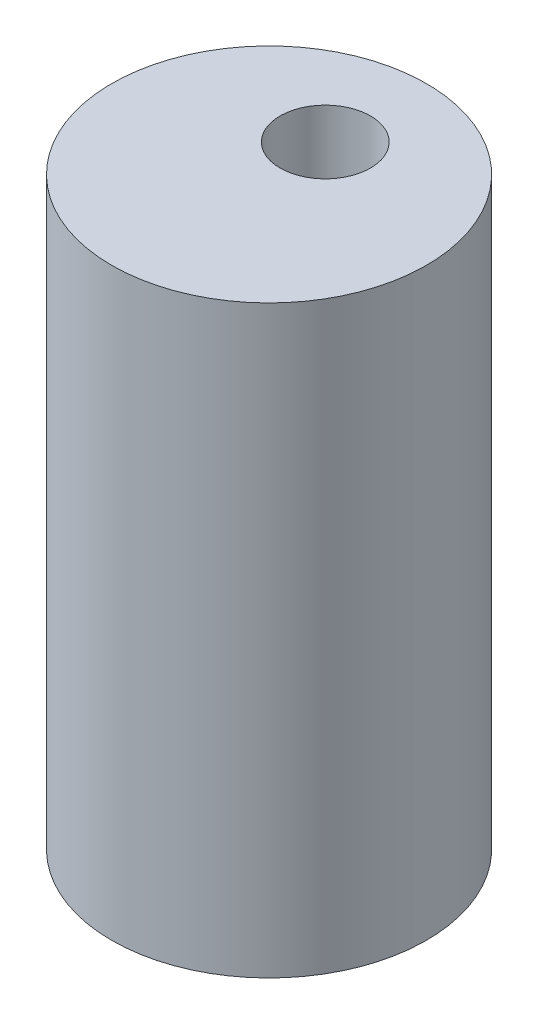
ISO-10303-21;
HEADER;
FILE_DESCRIPTION(('STEP AP214'),'2;1');
FILE_NAME('part.step','',(''),(''),'','','');
FILE_SCHEMA(('AUTOMOTIVE_DESIGN { 1 0 10303 214 1 1 1 1 }'));
ENDSEC;
DATA;
#1=APPLICATION_CONTEXT('core data for automotive mechanical design processes');
#2=APPLICATION_PROTOCOL_DEFINITION('international standard','automotive_design',2000,#1);
#3=PRODUCT_CONTEXT('',#1,'mechanical');
#4=PRODUCT('Part','Part','',(#3));
#5=PRODUCT_RELATED_PRODUCT_CATEGORY('part','',(#4));
#6=PRODUCT_DEFINITION_FORMATION('','',#4);
#7=PRODUCT_DEFINITION_CONTEXT('part definition',#1,'design');
#8=PRODUCT_DEFINITION('design','',#6,#7);
#9=PRODUCT_DEFINITION_SHAPE('','',#8);
#10=(LENGTH_UNIT() NAMED_UNIT(*) SI_UNIT(.MILLI.,.METRE.));
#11=(NAMED_UNIT(*) PLANE_ANGLE_UNIT() SI_UNIT($,.RADIAN.));
#12=(NAMED_UNIT(*) SI_UNIT($,.STERADIAN.) SOLID_ANGLE_UNIT());
#13=UNCERTAINTY_MEASURE_WITH_UNIT(LENGTH_MEASURE(1.E-05),#10,'distance_accuracy_value','');
#14=(GEOMETRIC_REPRESENTATION_CONTEXT(3) GLOBAL_UNCERTAINTY_ASSIGNED_CONTEXT((#13)) GLOBAL_UNIT_ASSIGNED_CONTEXT((#10,
#11,#12)) REPRESENTATION_CONTEXT('',''));
#15=CARTESIAN_POINT('',(0.,0.,0.));
#16=DIRECTION('',(0.,0.,1.));
#17=DIRECTION('',(1.,0.,0.));
#18=AXIS2_PLACEMENT_3D('',#15,#16,#17);
#19=CARTESIAN_POINT('',(0.,33.02,0.));
#20=DIRECTION('',(0.,-1.,0.));
#21=DIRECTION('',(0.,0.,-1.));
#22=AXIS2_PLACEMENT_3D('',#19,#20,#21);
#23=CYLINDRICAL_SURFACE('',#22,8.89);
#24=CARTESIAN_POINT('',(0.,11.65,-8.89));
#25=CARTESIAN_POINT('',(-0.0918360669877457,11.64999647283,-8.88999834303565));
#26=CARTESIAN_POINT('',(-0.183718222082188,11.6423069435029,-8.8885622582549));
#27=CARTESIAN_POINT('',(-0.364894510607066,11.6117711269655,-8.88297183715094));
#28=CARTESIAN_POINT('',(-0.454186373493418,11.5889119381136,-8.87881518705586));
#29=CARTESIAN_POINT('',(-0.627535571597222,11.5287598925168,-8.86824872883214));
#30=CARTESIAN_POINT('',(-0.711597513886059,11.4914799542296,-8.86184093780053));
#31=CARTESIAN_POINT('',(-0.872265407970495,11.4035810545302,-8.84747238156531));
#32=CARTESIAN_POINT('',(-0.948871986170377,11.3529632151039,-8.83951174700171));
#33=CARTESIAN_POINT('',(-1.0933623552347,11.2391941507481,-8.82281198574771));
#34=CARTESIAN_POINT('',(-1.16114591313639,11.1759166863103,-8.81406555084944));
#35=CARTESIAN_POINT('',(-1.28519912345379,11.0388961640361,-8.79683436847875));
#36=CARTESIAN_POINT('',(-1.3414679588416,10.9651523641884,-8.78834963961194));
#37=CARTESIAN_POINT('',(-1.44130991049973,10.8085860103999,-8.77253153492492));
#38=CARTESIAN_POINT('',(-1.48478133569139,10.7256975723758,-8.76520758410381));
#39=CARTESIAN_POINT('',(-1.55714355432885,10.5536354428308,-8.75264311096605));
#40=CARTESIAN_POINT('',(-1.58603557870358,10.4644622826496,-8.74740241276973));
#41=CARTESIAN_POINT('',(-1.62809772962431,10.2834335676463,-8.73967129984026));
#42=CARTESIAN_POINT('',(-1.64144249503182,10.1916199196691,-8.73715035895968));
#43=CARTESIAN_POINT('',(-1.65257333145617,10.0070248263135,-8.73505212846404));
#44=CARTESIAN_POINT('',(-1.65036076928692,9.91424346667,-8.73547458025248));
#45=CARTESIAN_POINT('',(-1.63058142770806,9.73161012096328,-8.73918760321734));
#46=CARTESIAN_POINT('',(-1.6132130014774,9.64173578866355,-8.74244112112337));
#47=CARTESIAN_POINT('',(-1.56392722949666,9.46619921773037,-8.7513915054644));
#48=CARTESIAN_POINT('',(-1.53200927681838,9.38053715497537,-8.75708847382646));
#49=CARTESIAN_POINT('',(-1.45433582547568,9.21527509931693,-8.77032271235711));
#50=CARTESIAN_POINT('',(-1.40850001750583,9.13571373834792,-8.77787061286426));
#51=CARTESIAN_POINT('',(-1.30434878394506,8.98533671980322,-8.79394919567166));
#52=CARTESIAN_POINT('',(-1.24603211650342,8.91452193362199,-8.80247997572982));
#53=CARTESIAN_POINT('',(-1.11750404515385,8.78250199761913,-8.81972469620462));
#54=CARTESIAN_POINT('',(-1.04712293208009,8.72146205183848,-8.82843943127757));
#55=CARTESIAN_POINT('',(-0.897032291024137,8.61203078175849,-8.84494905172169));
#56=CARTESIAN_POINT('',(-0.817322673063593,8.56363957947751,-8.85274392821888));
#57=CARTESIAN_POINT('',(-0.650666986376907,8.48085600174954,-8.86655081929005));
#58=CARTESIAN_POINT('',(-0.56371231582386,8.44648056043338,-8.8725606747996));
#59=CARTESIAN_POINT('',(-0.385126539176933,8.39287000825036,-8.88210363716019));
#60=CARTESIAN_POINT('',(-0.293495920751786,8.37363332193942,-8.88563700172789));
#61=CARTESIAN_POINT('',(-0.109580861960284,8.35107571155816,-8.88979353931392));
#62=CARTESIAN_POINT('',(-0.0173250945351158,8.34752839139869,-8.89045810543594));
#63=CARTESIAN_POINT('',(0.166461448475768,8.35584327832163,-8.88891641528337));
#64=CARTESIAN_POINT('',(0.257992258721995,8.36770474417421,-8.88671029710123));
#65=CARTESIAN_POINT('',(0.437014365909573,8.40631226420596,-8.87970088152735));
#66=CARTESIAN_POINT('',(0.524531166189811,8.43294399861579,-8.87491753949292));
#67=CARTESIAN_POINT('',(0.693857609465163,8.50021254408845,-8.86328780360091));
#68=CARTESIAN_POINT('',(0.775666870646203,8.54085029102559,-8.85644127188593));
#69=CARTESIAN_POINT('',(0.932223824168602,8.63548005198676,-8.84134136442335));
#70=CARTESIAN_POINT('',(1.00688631320318,8.68961069799965,-8.83307367953765));
#71=CARTESIAN_POINT('',(1.14614914716783,8.80950179820262,-8.81608602597825));
#72=CARTESIAN_POINT('',(1.21074857174194,8.87526331496524,-8.80736601603255));
#73=CARTESIAN_POINT('',(1.32890979773657,9.01757348294662,-8.79031951917097));
#74=CARTESIAN_POINT('',(1.3823172399646,9.0942512195168,-8.78199961943365));
#75=CARTESIAN_POINT('',(1.47549388738453,9.25562285786981,-8.76682699569519));
#76=CARTESIAN_POINT('',(1.51526359305373,9.34031646534084,-8.75997421785711));
#77=CARTESIAN_POINT('',(1.57981584904159,9.51492004044567,-8.74856321964528));
#78=CARTESIAN_POINT('',(1.60466972751142,9.6048028918009,-8.74399409657341));
#79=CARTESIAN_POINT('',(1.63890525586816,9.78756125700617,-8.73764259313261));
#80=CARTESIAN_POINT('',(1.64828861222198,9.88043643963648,-8.73585990540867));
#81=CARTESIAN_POINT('',(1.65126053733843,10.0649973892954,-8.73529848352062));
#82=CARTESIAN_POINT('',(1.64509253818836,10.1566791841931,-8.73647345142823));
#83=CARTESIAN_POINT('',(1.61766916571017,10.3376750041969,-8.74159240503477));
#84=CARTESIAN_POINT('',(1.59641387823341,10.4269890427733,-8.74553637497721));
#85=CARTESIAN_POINT('',(1.53952111511761,10.6005866185351,-8.75572962910272));
#86=CARTESIAN_POINT('',(1.50390948588735,10.6848788852853,-8.76197476865189));
#87=CARTESIAN_POINT('',(1.41934137828825,10.8463312196047,-8.77606971738909));
#88=CARTESIAN_POINT('',(1.37038398344548,10.9234907968738,-8.7839196367705));
#89=CARTESIAN_POINT('',(1.25966559219495,11.069707891699,-8.80048366955364));
#90=CARTESIAN_POINT('',(1.19772724245607,11.1386298913792,-8.80920877468623));
#91=CARTESIAN_POINT('',(1.0631754137633,11.2651835746176,-8.82645733620379));
#92=CARTESIAN_POINT('',(0.990559485307116,11.3228126604167,-8.83498074579631));
#93=CARTESIAN_POINT('',(0.835949120441948,11.4256172552533,-8.85095340184502));
#94=CARTESIAN_POINT('',(0.753877816618033,11.4706787766476,-8.85839254166897));
#95=CARTESIAN_POINT('',(0.583218459592901,11.5463020937754,-8.87125984086522));
#96=CARTESIAN_POINT('',(0.494636654963317,11.5768775881314,-8.87668989904423));
#97=CARTESIAN_POINT('',(0.3381550553749,11.6164114603862,-8.88381264039154));
#98=CARTESIAN_POINT('',(0.271173332415485,11.6289857679477,-8.88611986461802));
#99=CARTESIAN_POINT('',(0.136136164896605,11.6457812426063,-8.88921413993815));
#100=CARTESIAN_POINT('',(0.0680807467410451,11.6500026147937,-8.89000122835585));
#101=CARTESIAN_POINT('',(0.,11.65,-8.89));
#102=B_SPLINE_CURVE_WITH_KNOTS('',3,(#24,#25,#26,#27,#28,#29,#30,#31,#32,#33,#34,#35,#36,#37,
#38,#39,#40,#41,#42,#43,#44,#45,#46,#47,#48,#49,#50,#51,#52,#53,#54,#55,#56,#57,#58,#59,#60,#61,
#62,#63,#64,#65,#66,#67,#68,#69,#70,#71,#72,#73,#74,#75,#76,#77,#78,#79,#80,#81,#82,#83,#84,#85,
#86,#87,#88,#89,#90,#91,#92,#93,#94,#95,#96,#97,#98,#99,#100,#101),.UNSPECIFIED.,.T.,.F.,(4,2,2,
2,2,2,2,2,2,2,2,2,2,2,2,2,2,2,2,2,2,2,2,2,2,2,2,2,2,2,2,2,2,2,2,2,2,2,4),(0.,0.275259237063431,
0.550752879860564,0.826000298170887,1.10122457002126,1.37934396577062,1.65748308866312,
1.93777614170873,2.21804552584067,2.49513539156108,2.77220091341212,3.0456938076683,
3.31919811162536,3.59431159769617,3.86945247041094,4.14884033945583,4.42823090356605,
4.7079580398671,4.98765606196682,5.26330461732182,5.53893991326959,5.81247101741687,
6.08602040231177,6.36250539824232,6.6390156663354,6.91911954137987,7.1992131360795,
7.47795641098328,7.75666893721517,8.03104582861506,8.30542115873757,8.57930470823611,
8.85320707047261,9.13112903972105,9.40911486573917,9.68954559173565,9.96971059820533,
10.1737732846845,10.3778309607297),.UNSPECIFIED.);
#103=CARTESIAN_POINT('',(0.,11.65,-8.89));
#104=VERTEX_POINT('',#103);
#105=EDGE_CURVE('E79',#104,#104,#102,.T.);
#106=ORIENTED_EDGE('',*,*,#105,.T.);
#107=EDGE_LOOP('',(#106));
#108=FACE_BOUND('',#107,.T.);
#109=CARTESIAN_POINT('',(0.,33.02,0.));
#110=DIRECTION('',(0.,1.,0.));
#111=DIRECTION('',(0.,0.,1.));
#112=AXIS2_PLACEMENT_3D('',#109,#110,#111);
#113=CIRCLE('',#112,8.89);
#114=CARTESIAN_POINT('',(0.,33.02,8.89));
#115=VERTEX_POINT('',#114);
#116=EDGE_CURVE('E11',#115,#115,#113,.T.);
#117=ORIENTED_EDGE('',*,*,#116,.F.);
#118=EDGE_LOOP('',(#117));
#119=FACE_BOUND('',#118,.T.);
#120=CARTESIAN_POINT('',(0.,0.,0.));
#121=DIRECTION('',(0.,1.,0.));
#122=DIRECTION('',(0.,0.,1.));
#123=AXIS2_PLACEMENT_3D('',#120,#121,#122);
#124=CIRCLE('',#123,8.89);
#125=CARTESIAN_POINT('',(0.,0.,8.89));
#126=VERTEX_POINT('',#125);
#127=EDGE_CURVE('E48',#126,#126,#124,.T.);
#128=ORIENTED_EDGE('',*,*,#127,.T.);
#129=EDGE_LOOP('',(#128));
#130=FACE_BOUND('',#129,.T.);
#131=ADVANCED_FACE('F44',(#108,#119,#130),#23,.T.);
#132=CARTESIAN_POINT('',(0.,33.02,0.));
#133=DIRECTION('',(0.,1.,0.));
#134=DIRECTION('',(0.,0.,1.));
#135=AXIS2_PLACEMENT_3D('',#132,#133,#134);
#136=PLANE('',#135);
#137=CARTESIAN_POINT('',(0.,33.02,-3.175));
#138=DIRECTION('',(0.,1.,0.));
#139=DIRECTION('',(0.,0.,1.));
#140=AXIS2_PLACEMENT_3D('',#137,#138,#139);
#141=CIRCLE('',#140,2.55269999999999);
#142=CARTESIAN_POINT('',(0.,33.02,-0.622300000000011));
#143=VERTEX_POINT('',#142);
#144=EDGE_CURVE('E70',#143,#143,#141,.T.);
#145=ORIENTED_EDGE('',*,*,#144,.F.);
#146=EDGE_LOOP('',(#145));
#147=FACE_BOUND('',#146,.T.);
#148=ORIENTED_EDGE('',*,*,#116,.T.);
#149=EDGE_LOOP('',(#148));
#150=FACE_BOUND('',#149,.T.);
#151=ADVANCED_FACE('F95',(#147,#150),#136,.T.);
#152=CARTESIAN_POINT('',(0.,0.,0.));
#153=DIRECTION('',(0.,1.,0.));
#154=DIRECTION('',(0.,0.,1.));
#155=AXIS2_PLACEMENT_3D('',#152,#153,#154);
#156=PLANE('',#155);
#157=CARTESIAN_POINT('',(0.,0.,0.));
#158=DIRECTION('',(0.,-1.,0.));
#159=DIRECTION('',(0.,0.,-1.));
#160=AXIS2_PLACEMENT_3D('',#157,#158,#159);
#161=CIRCLE('',#160,3.);
#162=CARTESIAN_POINT('',(0.,0.,-3.));
#163=VERTEX_POINT('',#162);
#164=EDGE_CURVE('E71',#163,#163,#161,.T.);
#165=ORIENTED_EDGE('',*,*,#164,.F.);
#166=EDGE_LOOP('',(#165));
#167=FACE_BOUND('',#166,.T.);
#168=ORIENTED_EDGE('',*,*,#127,.F.);
#169=EDGE_LOOP('',(#168));
#170=FACE_BOUND('',#169,.T.);
#171=ADVANCED_FACE('F92',(#167,#170),#156,.F.);
#172=CARTESIAN_POINT('',(0.,20.32,-3.175));
#173=DIRECTION('',(0.,1.,0.));
#174=DIRECTION('',(0.,0.,1.));
#175=AXIS2_PLACEMENT_3D('',#172,#173,#174);
#176=CONICAL_SURFACE('',#175,2.5527,1.02974425867665);
#177=CARTESIAN_POINT('',(0.,18.7861830978084,-3.175));
#178=VERTEX_POINT('',#177);
#179=VERTEX_LOOP('',#178);
#180=FACE_BOUND('',#179,.T.);
#181=CARTESIAN_POINT('',(0.,20.32,-3.175));
#182=DIRECTION('',(0.,1.,0.));
#183=DIRECTION('',(0.,0.,1.));
#184=AXIS2_PLACEMENT_3D('',#181,#182,#183);
#185=CIRCLE('',#184,2.5527);
#186=CARTESIAN_POINT('',(0.,20.32,-0.622300000000003));
#187=VERTEX_POINT('',#186);
#188=EDGE_CURVE('E76',#187,#187,#185,.T.);
#189=ORIENTED_EDGE('',*,*,#188,.T.);
#190=EDGE_LOOP('',(#189));
#191=FACE_BOUND('',#190,.T.);
#192=ADVANCED_FACE('F94',(#180,#191),#176,.F.);
#193=CARTESIAN_POINT('',(0.,33.02,-3.175));
#194=DIRECTION('',(0.,1.,0.));
#195=DIRECTION('',(0.,0.,1.));
#196=AXIS2_PLACEMENT_3D('',#193,#194,#195);
#197=CYLINDRICAL_SURFACE('',#196,2.55269999999999);
#198=ORIENTED_EDGE('',*,*,#188,.F.);
#199=EDGE_LOOP('',(#198));
#200=FACE_BOUND('',#199,.T.);
#201=ORIENTED_EDGE('',*,*,#144,.T.);
#202=EDGE_LOOP('',(#201));
#203=FACE_BOUND('',#202,.T.);
#204=ADVANCED_FACE('F63',(#200,#203),#197,.F.);
#205=CARTESIAN_POINT('',(0.,17.9999894,0.));
#206=DIRECTION('',(0.,-1.,0.));
#207=DIRECTION('',(0.,0.,-1.));
#208=AXIS2_PLACEMENT_3D('',#205,#206,#207);
#209=CONICAL_SURFACE('',#208,3.,1.02974425867665);
#210=CARTESIAN_POINT('',(0.,19.8025712570827,0.));
#211=VERTEX_POINT('',#210);
#212=VERTEX_LOOP('',#211);
#213=FACE_BOUND('',#212,.T.);
#214=CARTESIAN_POINT('',(0.,17.9999894,0.));
#215=DIRECTION('',(0.,-1.,0.));
#216=DIRECTION('',(0.,0.,-1.));
#217=AXIS2_PLACEMENT_3D('',#214,#215,#216);
#218=CIRCLE('',#217,3.);
#219=CARTESIAN_POINT('',(0.,17.9999894,-3.));
#220=VERTEX_POINT('',#219);
#221=EDGE_CURVE('E67',#220,#220,#218,.T.);
#222=ORIENTED_EDGE('',*,*,#221,.T.);
#223=EDGE_LOOP('',(#222));
#224=FACE_BOUND('',#223,.T.);
#225=ADVANCED_FACE('F59',(#213,#224),#209,.F.);
#226=CARTESIAN_POINT('',(0.,0.,0.));
#227=DIRECTION('',(0.,-1.,0.));
#228=DIRECTION('',(0.,0.,-1.));
#229=AXIS2_PLACEMENT_3D('',#226,#227,#228);
#230=CYLINDRICAL_SURFACE('',#229,3.);
#231=CARTESIAN_POINT('',(0.,11.65,-3.));
#232=CARTESIAN_POINT('',(0.0856699475452993,11.6499946166217,-2.99999513886583));
#233=CARTESIAN_POINT('',(0.171409071205646,11.643289354409,-2.99629302255545));
#234=CARTESIAN_POINT('',(0.340286051726046,11.6167977847696,-2.9818478399119));
#235=CARTESIAN_POINT('',(0.423420195379859,11.596993621652,-2.97109516282084));
#236=CARTESIAN_POINT('',(0.584401577928635,11.5453455356783,-2.9436571869529));
#237=CARTESIAN_POINT('',(0.662269062667416,11.5135512213703,-2.92699634956489));
#238=CARTESIAN_POINT('',(0.81140824063576,11.439121331826,-2.8892116252981));
#239=CARTESIAN_POINT('',(0.88267965189667,11.3964852934199,-2.86808754775152));
#240=CARTESIAN_POINT('',(1.02211619357275,11.2982846668754,-2.82153252993505));
#241=CARTESIAN_POINT('',(1.0897303734279,11.2420324755558,-2.79590528013301));
#242=CARTESIAN_POINT('',(1.21508634233516,11.1197083915399,-2.74375354722835));
#243=CARTESIAN_POINT('',(1.27281890234559,11.0536274256305,-2.71722825277821));
#244=CARTESIAN_POINT('',(1.38251917690996,10.9057740140773,-2.66321895829991));
#245=CARTESIAN_POINT('',(1.43335857713386,10.8230970385153,-2.635897965792));
#246=CARTESIAN_POINT('',(1.52021547735939,10.6487726343674,-2.58678336476684));
#247=CARTESIAN_POINT('',(1.5562446891168,10.5571323651427,-2.56498539395023));
#248=CARTESIAN_POINT('',(1.60989890926138,10.3732305515727,-2.53163475086558));
#249=CARTESIAN_POINT('',(1.62854263347078,10.2813738465472,-2.51952192354843));
#250=CARTESIAN_POINT('',(1.64991120631133,10.0951105514433,-2.5055890563389));
#251=CARTESIAN_POINT('',(1.65265887915296,10.000707812976,-2.50375425894472));
#252=CARTESIAN_POINT('',(1.64290000078863,9.82757164325043,-2.51015646726158));
#253=CARTESIAN_POINT('',(1.63265157443423,9.74864024150067,-2.51690299364892));
#254=CARTESIAN_POINT('',(1.60118639026893,9.59387058009675,-2.53703527550373));
#255=CARTESIAN_POINT('',(1.57996463656909,9.5180337463059,-2.55042405491467));
#256=CARTESIAN_POINT('',(1.52687641342514,9.3695176799991,-2.58256130946142));
#257=CARTESIAN_POINT('',(1.4947903306966,9.2969417622077,-2.60141910516922));
#258=CARTESIAN_POINT('',(1.42107429999087,9.15782897940317,-2.64240902469132));
#259=CARTESIAN_POINT('',(1.3794402325366,9.09129473841806,-2.66454256035721));
#260=CARTESIAN_POINT('',(1.28018349411554,8.95510521641988,-2.71379040847906));
#261=CARTESIAN_POINT('',(1.22107458392542,8.88661394811562,-2.74113957142577));
#262=CARTESIAN_POINT('',(1.092245321965,8.75997341934865,-2.79497377887706));
#263=CARTESIAN_POINT('',(1.02251777065963,8.70183123410758,-2.82145822218593));
#264=CARTESIAN_POINT('',(0.868605041800927,8.59378517331663,-2.87272134052732));
#265=CARTESIAN_POINT('',(0.783763861453034,8.54469535937108,-2.89726648156192));
#266=CARTESIAN_POINT('',(0.605352377645225,8.46191924656254,-2.93971528365153));
#267=CARTESIAN_POINT('',(0.511790381195987,8.42821846583331,-2.95762518579738));
#268=CARTESIAN_POINT('',(0.327907037980972,8.38038778956177,-2.98333345624201));
#269=CARTESIAN_POINT('',(0.238095480523283,8.36472744848249,-2.99191822782612));
#270=CARTESIAN_POINT('',(0.0567325334425083,8.34846917129307,-3.00083376662002));
#271=CARTESIAN_POINT('',(-0.0348177069344392,8.34786161003822,-3.00116980828416));
#272=CARTESIAN_POINT('',(-0.207487375150862,8.36103451330555,-2.99394177831786));
#273=CARTESIAN_POINT('',(-0.288751776237443,8.3734146012818,-2.98714659587173));
#274=CARTESIAN_POINT('',(-0.447838849624851,8.40984259733265,-2.96746793830125));
#275=CARTESIAN_POINT('',(-0.525661172937914,8.43389168556647,-2.95458384737082));
#276=CARTESIAN_POINT('',(-0.677753407865906,8.49335761595169,-2.92349378037743));
#277=CARTESIAN_POINT('',(-0.751904240945379,8.52901769554693,-2.90517475144826));
#278=CARTESIAN_POINT('',(-0.893363199749705,8.61037134629974,-2.86484215103297));
#279=CARTESIAN_POINT('',(-0.960668811424108,8.65606858448362,-2.84282722996549));
#280=CARTESIAN_POINT('',(-1.09455456288909,8.76204471413837,-2.79420331593949));
#281=CARTESIAN_POINT('',(-1.16021004375818,8.82338328365901,-2.76735592347542));
#282=CARTESIAN_POINT('',(-1.28079913012788,8.9559244296775,-2.71365440736755));
#283=CARTESIAN_POINT('',(-1.33572155748716,9.02713715928238,-2.6868003055646));
#284=CARTESIAN_POINT('',(-1.43747254066661,9.18416419340714,-2.63385875511373));
#285=CARTESIAN_POINT('',(-1.48334076829298,9.27068307687538,-2.60799295737883));
#286=CARTESIAN_POINT('',(-1.55942876653783,9.45199407970867,-2.56323063992907));
#287=CARTESIAN_POINT('',(-1.58967133039468,9.54677391139993,-2.54432398053561));
#288=CARTESIAN_POINT('',(-1.6306246255404,9.73226237758553,-2.51825420457375));
#289=CARTESIAN_POINT('',(-1.64294477567078,9.8224747805395,-2.51013022153208));
#290=CARTESIAN_POINT('',(-1.65249034912289,10.004010469288,-2.50386093509844));
#291=CARTESIAN_POINT('',(-1.64972872967261,10.0953327342726,-2.50570706604924));
#292=CARTESIAN_POINT('',(-1.63075691736924,10.2632195215555,-2.51807870697285));
#293=CARTESIAN_POINT('',(-1.61642825416934,10.3401009735331,-2.52738874118223));
#294=CARTESIAN_POINT('',(-1.57741079979876,10.49019541896,-2.55192145753237));
#295=CARTESIAN_POINT('',(-1.55271775279779,10.5634068916,-2.56714656833463));
#296=CARTESIAN_POINT('',(-1.492056117962,10.709139646293,-2.60289749299613));
#297=CARTESIAN_POINT('',(-1.45548954002738,10.7813439958992,-2.62369085726804));
#298=CARTESIAN_POINT('',(-1.37268509596928,10.9190760215003,-2.66794671801683));
#299=CARTESIAN_POINT('',(-1.32644209751912,10.9846001267867,-2.69141062791391));
#300=CARTESIAN_POINT('',(-1.21715006880684,11.1178497395553,-2.74276036037727));
#301=CARTESIAN_POINT('',(-1.15260264369496,11.1843082351833,-2.77076245736401));
#302=CARTESIAN_POINT('',(-1.01279351012943,11.3058844274221,-2.82486614857147));
#303=CARTESIAN_POINT('',(-0.937524174112378,11.360993981549,-2.85096636964491));
#304=CARTESIAN_POINT('',(-0.774887264813819,11.4599380339659,-2.89948189270181));
#305=CARTESIAN_POINT('',(-0.687189892415584,11.5033135644064,-2.92173740350452));
#306=CARTESIAN_POINT('',(-0.504223640414889,11.5741097143307,-2.9587841790005));
#307=CARTESIAN_POINT('',(-0.408974898948845,11.6015712477707,-2.97359457153256));
#308=CARTESIAN_POINT('',(-0.260510618519068,11.6301420580123,-2.98911434756595));
#309=CARTESIAN_POINT('',(-0.208783056433918,11.6375724320123,-2.99318008334623));
#310=CARTESIAN_POINT('',(-0.104712273399591,11.6475030128209,-2.99862437594613));
#311=CARTESIAN_POINT('',(-0.0523690613485735,11.6500032907977,-3.00000297155585));
#312=CARTESIAN_POINT('',(0.,11.65,-3.));
#313=B_SPLINE_CURVE_WITH_KNOTS('',3,(#231,#232,#233,#234,#235,#236,#237,#238,#239,#240,#241,
#242,#243,#244,#245,#246,#247,#248,#249,#250,#251,#252,#253,#254,#255,#256,#257,#258,#259,#260,
#261,#262,#263,#264,#265,#266,#267,#268,#269,#270,#271,#272,#273,#274,#275,#276,#277,#278,#279,
#280,#281,#282,#283,#284,#285,#286,#287,#288,#289,#290,#291,#292,#293,#294,#295,#296,#297,#298,
#299,#300,#301,#302,#303,#304,#305,#306,#307,#308,#309,#310,#311,#312),.UNSPECIFIED.,.T.,.F.,(4,
2,2,2,2,2,2,2,2,2,2,2,2,2,2,2,2,2,2,2,2,2,2,2,2,2,2,2,2,2,2,2,2,2,2,2,2,2,2,2,4),(0.,
0.256799016537926,0.513948810602822,0.770046131883806,1.02615439574975,1.29988051794781,
1.57386091081863,1.87483382859251,2.1755682798451,2.45730761481343,2.73864231615319,
2.97715628850377,3.21577894619803,3.4595457638622,3.70341795322453,3.9857698226592,
4.26831398861795,4.56980790280869,4.87101750814849,5.14417314031285,5.41715410504552,
5.66345591892141,5.90978264803876,6.16164305576707,6.41359563296032,6.69375293580819,
6.97420047673713,7.2764362913265,7.57822997932255,7.85076329691245,8.1230625093144,
8.35830132419626,8.59363682764363,8.84338665158083,9.09326927891539,9.38234984684165,
9.67163710326647,9.97098879991465,10.2695674268337,10.4265480013941,10.5835263098519),.UNSPECIFIED.);
#314=CARTESIAN_POINT('',(0.,11.65,-3.));
#315=VERTEX_POINT('',#314);
#316=EDGE_CURVE('E116',#315,#315,#313,.T.);
#317=ORIENTED_EDGE('',*,*,#316,.T.);
#318=EDGE_LOOP('',(#317));
#319=FACE_BOUND('',#318,.T.);
#320=ORIENTED_EDGE('',*,*,#221,.F.);
#321=EDGE_LOOP('',(#320));
#322=FACE_BOUND('',#321,.T.);
#323=ORIENTED_EDGE('',*,*,#164,.T.);
#324=EDGE_LOOP('',(#323));
#325=FACE_BOUND('',#324,.T.);
#326=ADVANCED_FACE('F62',(#319,#322,#325),#230,.F.);
#327=CARTESIAN_POINT('',(0.,10.,-8.89));
#328=DIRECTION('',(0.,0.,-1.));
#329=DIRECTION('',(-1.,0.,0.));
#330=AXIS2_PLACEMENT_3D('',#327,#328,#329);
#331=CYLINDRICAL_SURFACE('',#330,1.64999999999999);
#332=ORIENTED_EDGE('',*,*,#316,.F.);
#333=EDGE_LOOP('',(#332));
#334=FACE_BOUND('',#333,.T.);
#335=ORIENTED_EDGE('',*,*,#105,.F.);
#336=EDGE_LOOP('',(#335));
#337=FACE_BOUND('',#336,.T.);
#338=ADVANCED_FACE('F128',(#334,#337),#331,.F.);
#339=CLOSED_SHELL('',(#131,#151,#171,#192,#204,#225,#326,#338));
#340=MANIFOLD_SOLID_BREP('B2',#339);
#341=ADVANCED_BREP_SHAPE_REPRESENTATION('',(#18,#340),#14);
#342=SHAPE_DEFINITION_REPRESENTATION(#9,#341);
ENDSEC;
END-ISO-10303-21;
